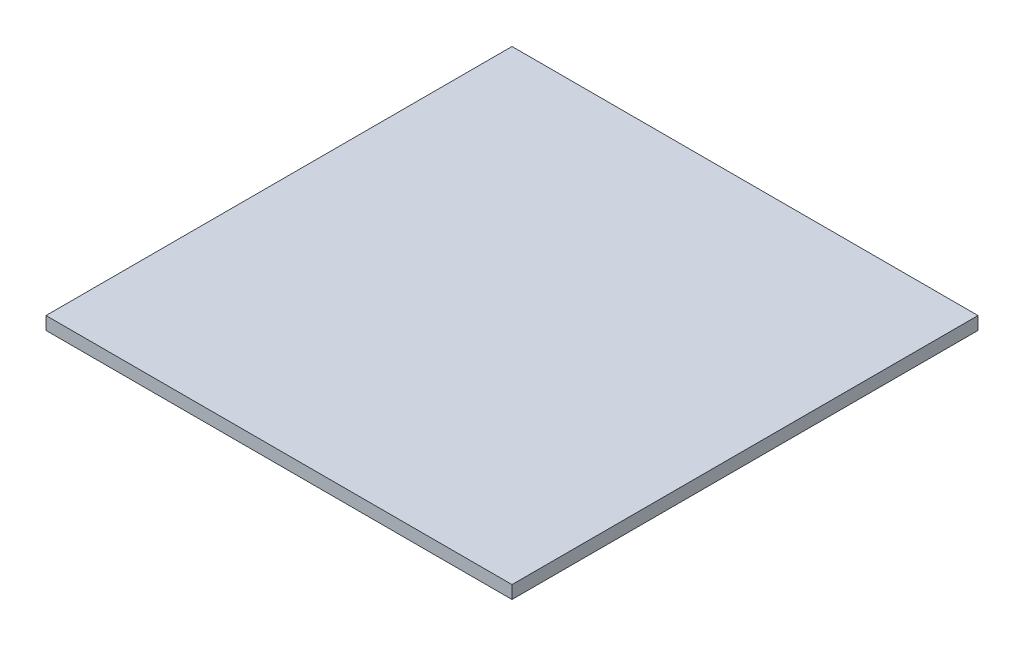
ISO-10303-21;
HEADER;
FILE_DESCRIPTION(('STEP AP214'),'2;1');
FILE_NAME('part.step','',(''),(''),'','','');
FILE_SCHEMA(('AUTOMOTIVE_DESIGN { 1 0 10303 214 1 1 1 1 }'));
ENDSEC;
DATA;
#1=APPLICATION_CONTEXT('core data for automotive mechanical design processes');
#2=APPLICATION_PROTOCOL_DEFINITION('international standard','automotive_design',2000,#1);
#3=PRODUCT_CONTEXT('',#1,'mechanical');
#4=PRODUCT('Part','Part','',(#3));
#5=PRODUCT_RELATED_PRODUCT_CATEGORY('part','',(#4));
#6=PRODUCT_DEFINITION_FORMATION('','',#4);
#7=PRODUCT_DEFINITION_CONTEXT('part definition',#1,'design');
#8=PRODUCT_DEFINITION('design','',#6,#7);
#9=PRODUCT_DEFINITION_SHAPE('','',#8);
#10=(LENGTH_UNIT() NAMED_UNIT(*) SI_UNIT(.MILLI.,.METRE.));
#11=(NAMED_UNIT(*) PLANE_ANGLE_UNIT() SI_UNIT($,.RADIAN.));
#12=(NAMED_UNIT(*) SI_UNIT($,.STERADIAN.) SOLID_ANGLE_UNIT());
#13=UNCERTAINTY_MEASURE_WITH_UNIT(LENGTH_MEASURE(1.E-05),#10,'distance_accuracy_value','');
#14=(GEOMETRIC_REPRESENTATION_CONTEXT(3) GLOBAL_UNCERTAINTY_ASSIGNED_CONTEXT((#13)) GLOBAL_UNIT_ASSIGNED_CONTEXT((#10,
#11,#12)) REPRESENTATION_CONTEXT('',''));
#15=CARTESIAN_POINT('',(0.,0.,0.));
#16=DIRECTION('',(0.,0.,1.));
#17=DIRECTION('',(1.,0.,0.));
#18=AXIS2_PLACEMENT_3D('',#15,#16,#17);
#19=CARTESIAN_POINT('',(914.4,50.8,914.4));
#20=DIRECTION('',(-1.,0.,0.));
#21=DIRECTION('',(0.,0.,1.));
#22=AXIS2_PLACEMENT_3D('',#19,#20,#21);
#23=PLANE('',#22);
#24=DIRECTION('',(0.,0.,-1.));
#25=VECTOR('',#24,1.);
#26=CARTESIAN_POINT('',(914.4,0.,914.4));
#27=LINE('',#26,#25);
#28=CARTESIAN_POINT('',(914.4,0.,914.4));
#29=VERTEX_POINT('',#28);
#30=CARTESIAN_POINT('',(914.4,0.,-914.4));
#31=VERTEX_POINT('',#30);
#32=EDGE_CURVE('E113',#29,#31,#27,.T.);
#33=ORIENTED_EDGE('',*,*,#32,.T.);
#34=DIRECTION('',(0.,-1.,0.));
#35=VECTOR('',#34,1.);
#36=CARTESIAN_POINT('',(914.4,50.8,-914.4));
#37=LINE('',#36,#35);
#38=CARTESIAN_POINT('',(914.4,50.8,-914.4));
#39=VERTEX_POINT('',#38);
#40=EDGE_CURVE('E11',#39,#31,#37,.T.);
#41=ORIENTED_EDGE('',*,*,#40,.F.);
#42=DIRECTION('',(0.,0.,-1.));
#43=VECTOR('',#42,1.);
#44=CARTESIAN_POINT('',(914.4,50.8,914.4));
#45=LINE('',#44,#43);
#46=CARTESIAN_POINT('',(914.4,50.8,914.4));
#47=VERTEX_POINT('',#46);
#48=EDGE_CURVE('E97',#47,#39,#45,.T.);
#49=ORIENTED_EDGE('',*,*,#48,.F.);
#50=DIRECTION('',(0.,-1.,0.));
#51=VECTOR('',#50,1.);
#52=CARTESIAN_POINT('',(914.4,50.8,914.4));
#53=LINE('',#52,#51);
#54=EDGE_CURVE('E109',#47,#29,#53,.T.);
#55=ORIENTED_EDGE('',*,*,#54,.T.);
#56=EDGE_LOOP('',(#33,#41,#49,#55));
#57=FACE_BOUND('',#56,.T.);
#58=ADVANCED_FACE('F45',(#57),#23,.F.);
#59=CARTESIAN_POINT('',(-914.4,50.8,-914.4));
#60=DIRECTION('',(0.,0.,1.));
#61=DIRECTION('',(1.,0.,0.));
#62=AXIS2_PLACEMENT_3D('',#59,#60,#61);
#63=PLANE('',#62);
#64=DIRECTION('',(-1.,0.,0.));
#65=VECTOR('',#64,1.);
#66=CARTESIAN_POINT('',(-914.4,0.,-914.4));
#67=LINE('',#66,#65);
#68=CARTESIAN_POINT('',(-914.4,0.,-914.4));
#69=VERTEX_POINT('',#68);
#70=EDGE_CURVE('E102',#31,#69,#67,.T.);
#71=ORIENTED_EDGE('',*,*,#70,.T.);
#72=DIRECTION('',(0.,-1.,0.));
#73=VECTOR('',#72,1.);
#74=CARTESIAN_POINT('',(-914.4,50.8,-914.4));
#75=LINE('',#74,#73);
#76=CARTESIAN_POINT('',(-914.4,50.8,-914.4));
#77=VERTEX_POINT('',#76);
#78=EDGE_CURVE('E54',#77,#69,#75,.T.);
#79=ORIENTED_EDGE('',*,*,#78,.F.);
#80=DIRECTION('',(-1.,0.,0.));
#81=VECTOR('',#80,1.);
#82=CARTESIAN_POINT('',(-914.4,50.8,-914.4));
#83=LINE('',#82,#81);
#84=EDGE_CURVE('E92',#39,#77,#83,.T.);
#85=ORIENTED_EDGE('',*,*,#84,.F.);
#86=ORIENTED_EDGE('',*,*,#40,.T.);
#87=EDGE_LOOP('',(#71,#79,#85,#86));
#88=FACE_BOUND('',#87,.T.);
#89=ADVANCED_FACE('F101',(#88),#63,.F.);
#90=CARTESIAN_POINT('',(-914.4,50.8,914.4));
#91=DIRECTION('',(1.,0.,0.));
#92=DIRECTION('',(0.,0.,-1.));
#93=AXIS2_PLACEMENT_3D('',#90,#91,#92);
#94=PLANE('',#93);
#95=DIRECTION('',(0.,0.,1.));
#96=VECTOR('',#95,1.);
#97=CARTESIAN_POINT('',(-914.4,0.,914.4));
#98=LINE('',#97,#96);
#99=CARTESIAN_POINT('',(-914.4,0.,914.4));
#100=VERTEX_POINT('',#99);
#101=EDGE_CURVE('E79',#69,#100,#98,.T.);
#102=ORIENTED_EDGE('',*,*,#101,.T.);
#103=DIRECTION('',(0.,-1.,0.));
#104=VECTOR('',#103,1.);
#105=CARTESIAN_POINT('',(-914.4,50.8,914.4));
#106=LINE('',#105,#104);
#107=CARTESIAN_POINT('',(-914.4,50.8,914.4));
#108=VERTEX_POINT('',#107);
#109=EDGE_CURVE('E104',#108,#100,#106,.T.);
#110=ORIENTED_EDGE('',*,*,#109,.F.);
#111=DIRECTION('',(0.,0.,1.));
#112=VECTOR('',#111,1.);
#113=CARTESIAN_POINT('',(-914.4,50.8,914.4));
#114=LINE('',#113,#112);
#115=EDGE_CURVE('E95',#77,#108,#114,.T.);
#116=ORIENTED_EDGE('',*,*,#115,.F.);
#117=ORIENTED_EDGE('',*,*,#78,.T.);
#118=EDGE_LOOP('',(#102,#110,#116,#117));
#119=FACE_BOUND('',#118,.T.);
#120=ADVANCED_FACE('F105',(#119),#94,.F.);
#121=CARTESIAN_POINT('',(-914.4,50.8,914.4));
#122=DIRECTION('',(0.,0.,-1.));
#123=DIRECTION('',(-1.,0.,0.));
#124=AXIS2_PLACEMENT_3D('',#121,#122,#123);
#125=PLANE('',#124);
#126=DIRECTION('',(1.,0.,0.));
#127=VECTOR('',#126,1.);
#128=CARTESIAN_POINT('',(-914.4,0.,914.4));
#129=LINE('',#128,#127);
#130=EDGE_CURVE('E85',#100,#29,#129,.T.);
#131=ORIENTED_EDGE('',*,*,#130,.T.);
#132=ORIENTED_EDGE('',*,*,#54,.F.);
#133=DIRECTION('',(1.,0.,0.));
#134=VECTOR('',#133,1.);
#135=CARTESIAN_POINT('',(-914.4,50.8,914.4));
#136=LINE('',#135,#134);
#137=EDGE_CURVE('E62',#108,#47,#136,.T.);
#138=ORIENTED_EDGE('',*,*,#137,.F.);
#139=ORIENTED_EDGE('',*,*,#109,.T.);
#140=EDGE_LOOP('',(#131,#132,#138,#139));
#141=FACE_BOUND('',#140,.T.);
#142=ADVANCED_FACE('F126',(#141),#125,.F.);
#143=CARTESIAN_POINT('',(0.,50.8,0.));
#144=DIRECTION('',(0.,-1.,0.));
#145=DIRECTION('',(0.,0.,-1.));
#146=AXIS2_PLACEMENT_3D('',#143,#144,#145);
#147=PLANE('',#146);
#148=ORIENTED_EDGE('',*,*,#48,.T.);
#149=ORIENTED_EDGE('',*,*,#84,.T.);
#150=ORIENTED_EDGE('',*,*,#115,.T.);
#151=ORIENTED_EDGE('',*,*,#137,.T.);
#152=EDGE_LOOP('',(#148,#149,#150,#151));
#153=FACE_BOUND('',#152,.T.);
#154=ADVANCED_FACE('F93',(#153),#147,.F.);
#155=CARTESIAN_POINT('',(0.,0.,0.));
#156=DIRECTION('',(0.,-1.,0.));
#157=DIRECTION('',(0.,0.,-1.));
#158=AXIS2_PLACEMENT_3D('',#155,#156,#157);
#159=PLANE('',#158);
#160=ORIENTED_EDGE('',*,*,#32,.F.);
#161=ORIENTED_EDGE('',*,*,#130,.F.);
#162=ORIENTED_EDGE('',*,*,#101,.F.);
#163=ORIENTED_EDGE('',*,*,#70,.F.);
#164=EDGE_LOOP('',(#160,#161,#162,#163));
#165=FACE_BOUND('',#164,.T.);
#166=ADVANCED_FACE('F129',(#165),#159,.T.);
#167=CLOSED_SHELL('',(#58,#89,#120,#142,#154,#166));
#168=MANIFOLD_SOLID_BREP('B2',#167);
#169=ADVANCED_BREP_SHAPE_REPRESENTATION('',(#18,#168),#14);
#170=SHAPE_DEFINITION_REPRESENTATION(#9,#169);
ENDSEC;
END-ISO-10303-21;
